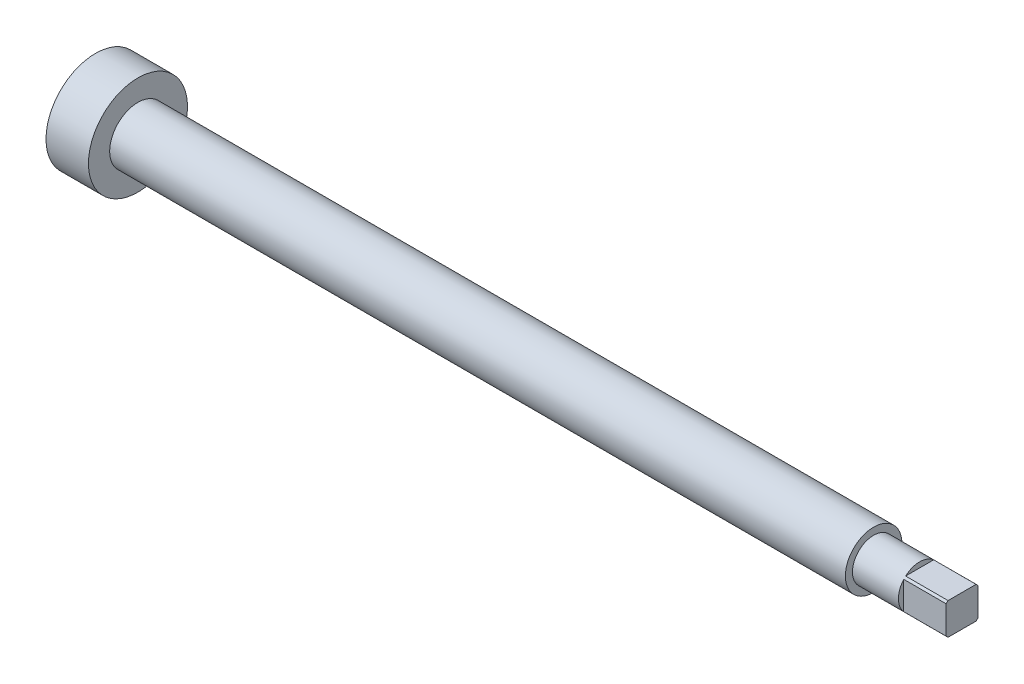
ISO-10303-21;
HEADER;
FILE_DESCRIPTION(('STEP AP214'),'2;1');
FILE_NAME('part.step','',(''),(''),'','','');
FILE_SCHEMA(('AUTOMOTIVE_DESIGN { 1 0 10303 214 1 1 1 1 }'));
ENDSEC;
DATA;
#1=APPLICATION_CONTEXT('core data for automotive mechanical design processes');
#2=APPLICATION_PROTOCOL_DEFINITION('international standard','automotive_design',2000,#1);
#3=PRODUCT_CONTEXT('',#1,'mechanical');
#4=PRODUCT('Part','Part','',(#3));
#5=PRODUCT_RELATED_PRODUCT_CATEGORY('part','',(#4));
#6=PRODUCT_DEFINITION_FORMATION('','',#4);
#7=PRODUCT_DEFINITION_CONTEXT('part definition',#1,'design');
#8=PRODUCT_DEFINITION('design','',#6,#7);
#9=PRODUCT_DEFINITION_SHAPE('','',#8);
#10=(LENGTH_UNIT() NAMED_UNIT(*) SI_UNIT(.MILLI.,.METRE.));
#11=(NAMED_UNIT(*) PLANE_ANGLE_UNIT() SI_UNIT($,.RADIAN.));
#12=(NAMED_UNIT(*) SI_UNIT($,.STERADIAN.) SOLID_ANGLE_UNIT());
#13=UNCERTAINTY_MEASURE_WITH_UNIT(LENGTH_MEASURE(1.E-05),#10,'distance_accuracy_value','');
#14=(GEOMETRIC_REPRESENTATION_CONTEXT(3) GLOBAL_UNCERTAINTY_ASSIGNED_CONTEXT((#13)) GLOBAL_UNIT_ASSIGNED_CONTEXT((#10,
#11,#12)) REPRESENTATION_CONTEXT('',''));
#15=CARTESIAN_POINT('',(0.,0.,0.));
#16=DIRECTION('',(0.,0.,1.));
#17=DIRECTION('',(1.,0.,0.));
#18=AXIS2_PLACEMENT_3D('',#15,#16,#17);
#19=CARTESIAN_POINT('',(-12.,0.,0.));
#20=DIRECTION('',(1.,0.,0.));
#21=DIRECTION('',(0.,0.,-1.));
#22=AXIS2_PLACEMENT_3D('',#19,#20,#21);
#23=PLANE('',#22);
#24=CARTESIAN_POINT('',(-12.,0.,0.));
#25=DIRECTION('',(-1.,0.,0.));
#26=DIRECTION('',(0.,0.,1.));
#27=AXIS2_PLACEMENT_3D('',#24,#25,#26);
#28=CIRCLE('',#27,14.);
#29=CARTESIAN_POINT('',(-12.,0.,14.));
#30=VERTEX_POINT('',#29);
#31=EDGE_CURVE('E139',#30,#30,#28,.T.);
#32=ORIENTED_EDGE('',*,*,#31,.T.);
#33=EDGE_LOOP('',(#32));
#34=FACE_BOUND('',#33,.T.);
#35=ADVANCED_FACE('F41',(#34),#23,.F.);
#36=CARTESIAN_POINT('',(500.,0.,0.));
#37=DIRECTION('',(-1.,0.,0.));
#38=DIRECTION('',(0.,0.,1.));
#39=AXIS2_PLACEMENT_3D('',#36,#37,#38);
#40=CYLINDRICAL_SURFACE('',#39,14.);
#41=ORIENTED_EDGE('',*,*,#31,.F.);
#42=EDGE_LOOP('',(#41));
#43=FACE_BOUND('',#42,.T.);
#44=CARTESIAN_POINT('',(0.,0.,0.));
#45=DIRECTION('',(-1.,0.,0.));
#46=DIRECTION('',(0.,0.,1.));
#47=AXIS2_PLACEMENT_3D('',#44,#45,#46);
#48=CIRCLE('',#47,14.);
#49=CARTESIAN_POINT('',(0.,0.,14.));
#50=VERTEX_POINT('',#49);
#51=EDGE_CURVE('E142',#50,#50,#48,.T.);
#52=ORIENTED_EDGE('',*,*,#51,.T.);
#53=EDGE_LOOP('',(#52));
#54=FACE_BOUND('',#53,.T.);
#55=ADVANCED_FACE('F210',(#43,#54),#40,.T.);
#56=CARTESIAN_POINT('',(0.,14.,0.));
#57=DIRECTION('',(-1.,0.,0.));
#58=DIRECTION('',(0.,0.,1.));
#59=AXIS2_PLACEMENT_3D('',#56,#57,#58);
#60=PLANE('',#59);
#61=ORIENTED_EDGE('',*,*,#51,.F.);
#62=EDGE_LOOP('',(#61));
#63=FACE_BOUND('',#62,.T.);
#64=CARTESIAN_POINT('',(0.,0.,0.));
#65=DIRECTION('',(-1.,0.,0.));
#66=DIRECTION('',(0.,0.,1.));
#67=AXIS2_PLACEMENT_3D('',#64,#65,#66);
#68=CIRCLE('',#67,8.);
#69=CARTESIAN_POINT('',(0.,0.,8.));
#70=VERTEX_POINT('',#69);
#71=EDGE_CURVE('E145',#70,#70,#68,.T.);
#72=ORIENTED_EDGE('',*,*,#71,.T.);
#73=EDGE_LOOP('',(#72));
#74=FACE_BOUND('',#73,.T.);
#75=ADVANCED_FACE('F215',(#63,#74),#60,.F.);
#76=CARTESIAN_POINT('',(500.,0.,0.));
#77=DIRECTION('',(-1.,0.,0.));
#78=DIRECTION('',(0.,0.,1.));
#79=AXIS2_PLACEMENT_3D('',#76,#77,#78);
#80=CYLINDRICAL_SURFACE('',#79,7.99999999999999);
#81=ORIENTED_EDGE('',*,*,#71,.F.);
#82=EDGE_LOOP('',(#81));
#83=FACE_BOUND('',#82,.T.);
#84=CARTESIAN_POINT('',(208.,0.,0.));
#85=DIRECTION('',(-1.,0.,0.));
#86=DIRECTION('',(0.,0.,1.));
#87=AXIS2_PLACEMENT_3D('',#84,#85,#86);
#88=CIRCLE('',#87,7.99999999999999);
#89=CARTESIAN_POINT('',(208.,0.,7.99999999999999));
#90=VERTEX_POINT('',#89);
#91=EDGE_CURVE('E148',#90,#90,#88,.T.);
#92=ORIENTED_EDGE('',*,*,#91,.T.);
#93=EDGE_LOOP('',(#92));
#94=FACE_BOUND('',#93,.T.);
#95=ADVANCED_FACE('F223',(#83,#94),#80,.T.);
#96=CARTESIAN_POINT('',(208.,7.99999999999999,0.));
#97=DIRECTION('',(-1.,0.,0.));
#98=DIRECTION('',(0.,0.,1.));
#99=AXIS2_PLACEMENT_3D('',#96,#97,#98);
#100=PLANE('',#99);
#101=ORIENTED_EDGE('',*,*,#91,.F.);
#102=EDGE_LOOP('',(#101));
#103=FACE_BOUND('',#102,.T.);
#104=CARTESIAN_POINT('',(208.,0.,0.));
#105=DIRECTION('',(-1.,0.,0.));
#106=DIRECTION('',(0.,0.,1.));
#107=AXIS2_PLACEMENT_3D('',#104,#105,#106);
#108=CIRCLE('',#107,6.);
#109=CARTESIAN_POINT('',(208.,0.,6.));
#110=VERTEX_POINT('',#109);
#111=EDGE_CURVE('E151',#110,#110,#108,.T.);
#112=ORIENTED_EDGE('',*,*,#111,.T.);
#113=EDGE_LOOP('',(#112));
#114=FACE_BOUND('',#113,.T.);
#115=ADVANCED_FACE('F229',(#103,#114),#100,.F.);
#116=CARTESIAN_POINT('',(500.,0.,0.));
#117=DIRECTION('',(-1.,0.,0.));
#118=DIRECTION('',(0.,0.,1.));
#119=AXIS2_PLACEMENT_3D('',#116,#117,#118);
#120=CYLINDRICAL_SURFACE('',#119,6.);
#121=ORIENTED_EDGE('',*,*,#111,.F.);
#122=EDGE_LOOP('',(#121));
#123=FACE_BOUND('',#122,.T.);
#124=CARTESIAN_POINT('',(233.,0.,0.));
#125=DIRECTION('',(-1.,0.,0.));
#126=DIRECTION('',(0.,0.,1.));
#127=AXIS2_PLACEMENT_3D('',#124,#125,#126);
#128=CIRCLE('',#127,6.);
#129=CARTESIAN_POINT('',(233.,3.96862696659689,4.5));
#130=VERTEX_POINT('',#129);
#131=CARTESIAN_POINT('',(233.,4.5,3.96862696659689));
#132=VERTEX_POINT('',#131);
#133=EDGE_CURVE('E154',#130,#132,#128,.T.);
#134=ORIENTED_EDGE('',*,*,#133,.T.);
#135=DIRECTION('',(-1.,0.,0.));
#136=VECTOR('',#135,1.);
#137=CARTESIAN_POINT('',(500.,4.5,3.96862696659689));
#138=LINE('',#137,#136);
#139=CARTESIAN_POINT('',(221.,4.5,3.96862696659689));
#140=VERTEX_POINT('',#139);
#141=EDGE_CURVE('E158',#132,#140,#138,.T.);
#142=ORIENTED_EDGE('',*,*,#141,.T.);
#143=CARTESIAN_POINT('',(221.,0.,0.));
#144=DIRECTION('',(1.,0.,0.));
#145=DIRECTION('',(0.,0.,-1.));
#146=AXIS2_PLACEMENT_3D('',#143,#144,#145);
#147=CIRCLE('',#146,6.);
#148=CARTESIAN_POINT('',(221.,4.5,-3.96862696659689));
#149=VERTEX_POINT('',#148);
#150=EDGE_CURVE('E11',#149,#140,#147,.T.);
#151=ORIENTED_EDGE('',*,*,#150,.F.);
#152=DIRECTION('',(-1.,0.,0.));
#153=VECTOR('',#152,1.);
#154=CARTESIAN_POINT('',(500.,4.5,-3.96862696659689));
#155=LINE('',#154,#153);
#156=CARTESIAN_POINT('',(233.,4.5,-3.96862696659689));
#157=VERTEX_POINT('',#156);
#158=EDGE_CURVE('E161',#149,#157,#155,.F.);
#159=ORIENTED_EDGE('',*,*,#158,.T.);
#160=CARTESIAN_POINT('',(233.,3.96862696659689,-4.5));
#161=VERTEX_POINT('',#160);
#162=EDGE_CURVE('E156',#157,#161,#128,.T.);
#163=ORIENTED_EDGE('',*,*,#162,.T.);
#164=DIRECTION('',(-1.,0.,0.));
#165=VECTOR('',#164,1.);
#166=CARTESIAN_POINT('',(500.,3.96862696659689,-4.5));
#167=LINE('',#166,#165);
#168=CARTESIAN_POINT('',(221.,3.96862696659689,-4.5));
#169=VERTEX_POINT('',#168);
#170=EDGE_CURVE('E118',#161,#169,#167,.T.);
#171=ORIENTED_EDGE('',*,*,#170,.T.);
#172=CARTESIAN_POINT('',(221.,-3.96862696659689,-4.5));
#173=VERTEX_POINT('',#172);
#174=EDGE_CURVE('E44',#173,#169,#147,.T.);
#175=ORIENTED_EDGE('',*,*,#174,.F.);
#176=DIRECTION('',(-1.,0.,0.));
#177=VECTOR('',#176,1.);
#178=CARTESIAN_POINT('',(500.,-3.96862696659689,-4.5));
#179=LINE('',#178,#177);
#180=CARTESIAN_POINT('',(233.,-3.96862696659689,-4.5));
#181=VERTEX_POINT('',#180);
#182=EDGE_CURVE('E107',#173,#181,#179,.F.);
#183=ORIENTED_EDGE('',*,*,#182,.T.);
#184=CARTESIAN_POINT('',(233.,-4.5,-3.96862696659689));
#185=VERTEX_POINT('',#184);
#186=EDGE_CURVE('E188',#181,#185,#128,.T.);
#187=ORIENTED_EDGE('',*,*,#186,.T.);
#188=DIRECTION('',(-1.,0.,0.));
#189=VECTOR('',#188,1.);
#190=CARTESIAN_POINT('',(500.,-4.5,-3.96862696659689));
#191=LINE('',#190,#189);
#192=CARTESIAN_POINT('',(221.,-4.5,-3.96862696659689));
#193=VERTEX_POINT('',#192);
#194=EDGE_CURVE('E64',#185,#193,#191,.T.);
#195=ORIENTED_EDGE('',*,*,#194,.T.);
#196=CARTESIAN_POINT('',(221.,-4.5,3.96862696659689));
#197=VERTEX_POINT('',#196);
#198=EDGE_CURVE('E127',#197,#193,#147,.T.);
#199=ORIENTED_EDGE('',*,*,#198,.F.);
#200=DIRECTION('',(-1.,0.,0.));
#201=VECTOR('',#200,1.);
#202=CARTESIAN_POINT('',(500.,-4.5,3.96862696659689));
#203=LINE('',#202,#201);
#204=CARTESIAN_POINT('',(233.,-4.5,3.96862696659689));
#205=VERTEX_POINT('',#204);
#206=EDGE_CURVE('E169',#197,#205,#203,.F.);
#207=ORIENTED_EDGE('',*,*,#206,.T.);
#208=CARTESIAN_POINT('',(233.,-3.96862696659689,4.5));
#209=VERTEX_POINT('',#208);
#210=EDGE_CURVE('E157',#205,#209,#128,.T.);
#211=ORIENTED_EDGE('',*,*,#210,.T.);
#212=DIRECTION('',(-1.,0.,0.));
#213=VECTOR('',#212,1.);
#214=CARTESIAN_POINT('',(500.,-3.96862696659689,4.5));
#215=LINE('',#214,#213);
#216=CARTESIAN_POINT('',(221.,-3.96862696659689,4.5));
#217=VERTEX_POINT('',#216);
#218=EDGE_CURVE('E56',#209,#217,#215,.T.);
#219=ORIENTED_EDGE('',*,*,#218,.T.);
#220=CARTESIAN_POINT('',(221.,3.96862696659689,4.5));
#221=VERTEX_POINT('',#220);
#222=EDGE_CURVE('E49',#221,#217,#147,.T.);
#223=ORIENTED_EDGE('',*,*,#222,.F.);
#224=DIRECTION('',(-1.,0.,0.));
#225=VECTOR('',#224,1.);
#226=CARTESIAN_POINT('',(500.,3.96862696659689,4.5));
#227=LINE('',#226,#225);
#228=EDGE_CURVE('E165',#221,#130,#227,.F.);
#229=ORIENTED_EDGE('',*,*,#228,.T.);
#230=EDGE_LOOP('',(#134,#142,#151,#159,#163,#171,#175,#183,#187,#195,#199,#207,#211,#219,#223,#229));
#231=FACE_BOUND('',#230,.T.);
#232=ADVANCED_FACE('F125',(#123,#231),#120,.T.);
#233=CARTESIAN_POINT('',(233.,6.,0.));
#234=DIRECTION('',(-1.,0.,0.));
#235=DIRECTION('',(0.,0.,1.));
#236=AXIS2_PLACEMENT_3D('',#233,#234,#235);
#237=PLANE('',#236);
#238=ORIENTED_EDGE('',*,*,#162,.F.);
#239=DIRECTION('',(0.,0.,1.));
#240=VECTOR('',#239,1.);
#241=CARTESIAN_POINT('',(233.,4.5,0.));
#242=LINE('',#241,#240);
#243=EDGE_CURVE('E128',#157,#132,#242,.T.);
#244=ORIENTED_EDGE('',*,*,#243,.T.);
#245=ORIENTED_EDGE('',*,*,#133,.F.);
#246=DIRECTION('',(0.,-1.,0.));
#247=VECTOR('',#246,1.);
#248=CARTESIAN_POINT('',(233.,6.,4.5));
#249=LINE('',#248,#247);
#250=EDGE_CURVE('E130',#130,#209,#249,.T.);
#251=ORIENTED_EDGE('',*,*,#250,.T.);
#252=ORIENTED_EDGE('',*,*,#210,.F.);
#253=DIRECTION('',(0.,0.,-1.));
#254=VECTOR('',#253,1.);
#255=CARTESIAN_POINT('',(233.,-4.5,0.));
#256=LINE('',#255,#254);
#257=EDGE_CURVE('E134',#205,#185,#256,.T.);
#258=ORIENTED_EDGE('',*,*,#257,.T.);
#259=ORIENTED_EDGE('',*,*,#186,.F.);
#260=DIRECTION('',(0.,1.,0.));
#261=VECTOR('',#260,1.);
#262=CARTESIAN_POINT('',(233.,6.,-4.5));
#263=LINE('',#262,#261);
#264=EDGE_CURVE('E113',#181,#161,#263,.T.);
#265=ORIENTED_EDGE('',*,*,#264,.T.);
#266=EDGE_LOOP('',(#238,#244,#245,#251,#252,#258,#259,#265));
#267=FACE_BOUND('',#266,.T.);
#268=ADVANCED_FACE('F184',(#267),#237,.F.);
#269=CARTESIAN_POINT('',(233.,-4.5,-4.5));
#270=DIRECTION('',(0.,0.,1.));
#271=DIRECTION('',(1.,0.,0.));
#272=AXIS2_PLACEMENT_3D('',#269,#270,#271);
#273=PLANE('',#272);
#274=ORIENTED_EDGE('',*,*,#264,.F.);
#275=ORIENTED_EDGE('',*,*,#182,.F.);
#276=DIRECTION('',(0.,1.,0.));
#277=VECTOR('',#276,1.);
#278=CARTESIAN_POINT('',(221.,-4.5,-4.5));
#279=LINE('',#278,#277);
#280=EDGE_CURVE('E110',#173,#169,#279,.T.);
#281=ORIENTED_EDGE('',*,*,#280,.T.);
#282=ORIENTED_EDGE('',*,*,#170,.F.);
#283=EDGE_LOOP('',(#274,#275,#281,#282));
#284=FACE_BOUND('',#283,.T.);
#285=ADVANCED_FACE('F109',(#284),#273,.F.);
#286=CARTESIAN_POINT('',(221.,0.,0.));
#287=DIRECTION('',(1.,0.,0.));
#288=DIRECTION('',(0.,0.,-1.));
#289=AXIS2_PLACEMENT_3D('',#286,#287,#288);
#290=PLANE('',#289);
#291=ORIENTED_EDGE('',*,*,#174,.T.);
#292=ORIENTED_EDGE('',*,*,#280,.F.);
#293=EDGE_LOOP('',(#291,#292));
#294=FACE_BOUND('',#293,.T.);
#295=ADVANCED_FACE('F121',(#294),#290,.T.);
#296=CARTESIAN_POINT('',(233.,-4.5,4.5));
#297=DIRECTION('',(0.,1.,0.));
#298=DIRECTION('',(0.,0.,1.));
#299=AXIS2_PLACEMENT_3D('',#296,#297,#298);
#300=PLANE('',#299);
#301=ORIENTED_EDGE('',*,*,#257,.F.);
#302=ORIENTED_EDGE('',*,*,#206,.F.);
#303=DIRECTION('',(0.,0.,-1.));
#304=VECTOR('',#303,1.);
#305=CARTESIAN_POINT('',(221.,-4.5,4.5));
#306=LINE('',#305,#304);
#307=EDGE_CURVE('E122',#197,#193,#306,.T.);
#308=ORIENTED_EDGE('',*,*,#307,.T.);
#309=ORIENTED_EDGE('',*,*,#194,.F.);
#310=EDGE_LOOP('',(#301,#302,#308,#309));
#311=FACE_BOUND('',#310,.T.);
#312=ADVANCED_FACE('F189',(#311),#300,.F.);
#313=ORIENTED_EDGE('',*,*,#198,.T.);
#314=ORIENTED_EDGE('',*,*,#307,.F.);
#315=EDGE_LOOP('',(#313,#314));
#316=FACE_BOUND('',#315,.T.);
#317=ADVANCED_FACE('F192',(#316),#290,.T.);
#318=CARTESIAN_POINT('',(233.,4.5,4.5));
#319=DIRECTION('',(0.,0.,-1.));
#320=DIRECTION('',(-1.,0.,0.));
#321=AXIS2_PLACEMENT_3D('',#318,#319,#320);
#322=PLANE('',#321);
#323=ORIENTED_EDGE('',*,*,#250,.F.);
#324=ORIENTED_EDGE('',*,*,#228,.F.);
#325=DIRECTION('',(0.,-1.,0.));
#326=VECTOR('',#325,1.);
#327=CARTESIAN_POINT('',(221.,4.5,4.5));
#328=LINE('',#327,#326);
#329=EDGE_CURVE('E174',#221,#217,#328,.T.);
#330=ORIENTED_EDGE('',*,*,#329,.T.);
#331=ORIENTED_EDGE('',*,*,#218,.F.);
#332=EDGE_LOOP('',(#323,#324,#330,#331));
#333=FACE_BOUND('',#332,.T.);
#334=ADVANCED_FACE('F194',(#333),#322,.F.);
#335=ORIENTED_EDGE('',*,*,#222,.T.);
#336=ORIENTED_EDGE('',*,*,#329,.F.);
#337=EDGE_LOOP('',(#335,#336));
#338=FACE_BOUND('',#337,.T.);
#339=ADVANCED_FACE('F196',(#338),#290,.T.);
#340=ORIENTED_EDGE('',*,*,#150,.T.);
#341=DIRECTION('',(0.,0.,1.));
#342=VECTOR('',#341,1.);
#343=CARTESIAN_POINT('',(221.,4.5,-4.5));
#344=LINE('',#343,#342);
#345=EDGE_CURVE('E176',#149,#140,#344,.T.);
#346=ORIENTED_EDGE('',*,*,#345,.F.);
#347=EDGE_LOOP('',(#340,#346));
#348=FACE_BOUND('',#347,.T.);
#349=ADVANCED_FACE('F203',(#348),#290,.T.);
#350=CARTESIAN_POINT('',(233.,4.5,-4.5));
#351=DIRECTION('',(0.,-1.,0.));
#352=DIRECTION('',(0.,0.,-1.));
#353=AXIS2_PLACEMENT_3D('',#350,#351,#352);
#354=PLANE('',#353);
#355=ORIENTED_EDGE('',*,*,#243,.F.);
#356=ORIENTED_EDGE('',*,*,#158,.F.);
#357=ORIENTED_EDGE('',*,*,#345,.T.);
#358=ORIENTED_EDGE('',*,*,#141,.F.);
#359=EDGE_LOOP('',(#355,#356,#357,#358));
#360=FACE_BOUND('',#359,.T.);
#361=ADVANCED_FACE('F180',(#360),#354,.F.);
#362=CLOSED_SHELL('',(#35,#55,#75,#95,#115,#232,#268,#285,#295,#312,#317,#334,#339,#349,#361));
#363=MANIFOLD_SOLID_BREP('B2',#362);
#364=ADVANCED_BREP_SHAPE_REPRESENTATION('',(#18,#363),#14);
#365=SHAPE_DEFINITION_REPRESENTATION(#9,#364);
ENDSEC;
END-ISO-10303-21;
